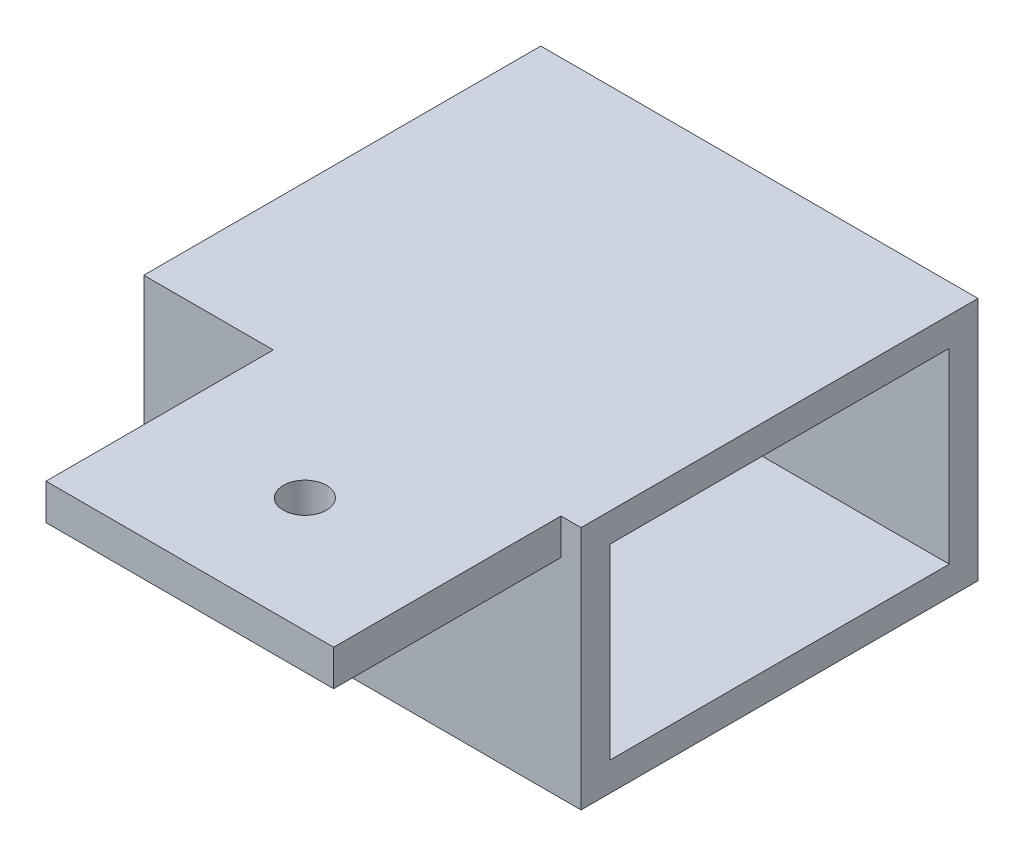
ISO-10303-21;
HEADER;
FILE_DESCRIPTION(('STEP AP214'),'2;1');
FILE_NAME('part.step','',(''),(''),'','','');
FILE_SCHEMA(('AUTOMOTIVE_DESIGN { 1 0 10303 214 1 1 1 1 }'));
ENDSEC;
DATA;
#1=APPLICATION_CONTEXT('core data for automotive mechanical design processes');
#2=APPLICATION_PROTOCOL_DEFINITION('international standard','automotive_design',2000,#1);
#3=PRODUCT_CONTEXT('',#1,'mechanical');
#4=PRODUCT('Part','Part','',(#3));
#5=PRODUCT_RELATED_PRODUCT_CATEGORY('part','',(#4));
#6=PRODUCT_DEFINITION_FORMATION('','',#4);
#7=PRODUCT_DEFINITION_CONTEXT('part definition',#1,'design');
#8=PRODUCT_DEFINITION('design','',#6,#7);
#9=PRODUCT_DEFINITION_SHAPE('','',#8);
#10=(LENGTH_UNIT() NAMED_UNIT(*) SI_UNIT(.MILLI.,.METRE.));
#11=(NAMED_UNIT(*) PLANE_ANGLE_UNIT() SI_UNIT($,.RADIAN.));
#12=(NAMED_UNIT(*) SI_UNIT($,.STERADIAN.) SOLID_ANGLE_UNIT());
#13=UNCERTAINTY_MEASURE_WITH_UNIT(LENGTH_MEASURE(1.E-05),#10,'distance_accuracy_value','');
#14=(GEOMETRIC_REPRESENTATION_CONTEXT(3) GLOBAL_UNCERTAINTY_ASSIGNED_CONTEXT((#13)) GLOBAL_UNIT_ASSIGNED_CONTEXT((#10,
#11,#12)) REPRESENTATION_CONTEXT('',''));
#15=CARTESIAN_POINT('',(0.,0.,0.));
#16=DIRECTION('',(0.,0.,1.));
#17=DIRECTION('',(1.,0.,0.));
#18=AXIS2_PLACEMENT_3D('',#15,#16,#17);
#19=CARTESIAN_POINT('',(-10.,-1.5,8.));
#20=DIRECTION('',(1.,0.,0.));
#21=DIRECTION('',(0.,0.,-1.));
#22=AXIS2_PLACEMENT_3D('',#19,#20,#21);
#23=PLANE('',#22);
#24=DIRECTION('',(0.,0.,-1.));
#25=VECTOR('',#24,1.);
#26=CARTESIAN_POINT('',(-10.,-1.5,8.));
#27=LINE('',#26,#25);
#28=CARTESIAN_POINT('',(-10.,-1.5,8.));
#29=VERTEX_POINT('',#28);
#30=CARTESIAN_POINT('',(-9.99999999999999,-1.5,-7.8));
#31=VERTEX_POINT('',#30);
#32=EDGE_CURVE('E158',#29,#31,#27,.T.);
#33=ORIENTED_EDGE('',*,*,#32,.T.);
#34=DIRECTION('',(0.,-1.,0.));
#35=VECTOR('',#34,1.);
#36=CARTESIAN_POINT('',(-10.,-1.5,-7.8));
#37=LINE('',#36,#35);
#38=CARTESIAN_POINT('',(-10.,-4.,-7.8));
#39=VERTEX_POINT('',#38);
#40=EDGE_CURVE('E168',#31,#39,#37,.T.);
#41=ORIENTED_EDGE('',*,*,#40,.T.);
#42=DIRECTION('',(0.,0.,-1.));
#43=VECTOR('',#42,1.);
#44=CARTESIAN_POINT('',(-10.,-4.,8.));
#45=LINE('',#44,#43);
#46=CARTESIAN_POINT('',(-10.,-4.,8.));
#47=VERTEX_POINT('',#46);
#48=EDGE_CURVE('E149',#47,#39,#45,.T.);
#49=ORIENTED_EDGE('',*,*,#48,.F.);
#50=DIRECTION('',(0.,-1.,0.));
#51=VECTOR('',#50,1.);
#52=CARTESIAN_POINT('',(-10.,-1.5,8.));
#53=LINE('',#52,#51);
#54=EDGE_CURVE('E170',#29,#47,#53,.T.);
#55=ORIENTED_EDGE('',*,*,#54,.F.);
#56=EDGE_LOOP('',(#33,#41,#49,#55));
#57=FACE_BOUND('',#56,.T.);
#58=ADVANCED_FACE('F39',(#57),#23,.F.);
#59=CARTESIAN_POINT('',(-10.,-4.,8.));
#60=DIRECTION('',(0.,1.,0.));
#61=DIRECTION('',(0.,0.,1.));
#62=AXIS2_PLACEMENT_3D('',#59,#60,#61);
#63=PLANE('',#62);
#64=CARTESIAN_POINT('',(0.,-4.,0.));
#65=DIRECTION('',(0.,1.,0.));
#66=DIRECTION('',(0.,0.,1.));
#67=AXIS2_PLACEMENT_3D('',#64,#65,#66);
#68=CIRCLE('',#67,1.5);
#69=CARTESIAN_POINT('',(0.,-4.,-1.5));
#70=VERTEX_POINT('',#69);
#71=EDGE_CURVE('E220',#70,#70,#68,.F.);
#72=ORIENTED_EDGE('',*,*,#71,.F.);
#73=EDGE_LOOP('',(#72));
#74=FACE_BOUND('',#73,.T.);
#75=ORIENTED_EDGE('',*,*,#48,.T.);
#76=DIRECTION('',(1.,0.,0.));
#77=VECTOR('',#76,1.);
#78=CARTESIAN_POINT('',(-10.,-4.,-7.8));
#79=LINE('',#78,#77);
#80=CARTESIAN_POINT('',(10.,-4.,-7.8));
#81=VERTEX_POINT('',#80);
#82=EDGE_CURVE('E172',#39,#81,#79,.T.);
#83=ORIENTED_EDGE('',*,*,#82,.T.);
#84=DIRECTION('',(0.,0.,-1.));
#85=VECTOR('',#84,1.);
#86=CARTESIAN_POINT('',(10.,-4.,8.));
#87=LINE('',#86,#85);
#88=CARTESIAN_POINT('',(10.,-4.,8.));
#89=VERTEX_POINT('',#88);
#90=EDGE_CURVE('E155',#89,#81,#87,.T.);
#91=ORIENTED_EDGE('',*,*,#90,.F.);
#92=DIRECTION('',(1.,0.,0.));
#93=VECTOR('',#92,1.);
#94=CARTESIAN_POINT('',(-10.,-4.,8.));
#95=LINE('',#94,#93);
#96=EDGE_CURVE('E164',#47,#89,#95,.T.);
#97=ORIENTED_EDGE('',*,*,#96,.F.);
#98=EDGE_LOOP('',(#75,#83,#91,#97));
#99=FACE_BOUND('',#98,.T.);
#100=ADVANCED_FACE('F244',(#74,#99),#63,.F.);
#101=CARTESIAN_POINT('',(10.,-4.,8.));
#102=DIRECTION('',(-1.,0.,0.));
#103=DIRECTION('',(0.,0.,1.));
#104=AXIS2_PLACEMENT_3D('',#101,#102,#103);
#105=PLANE('',#104);
#106=ORIENTED_EDGE('',*,*,#90,.T.);
#107=DIRECTION('',(0.,1.,0.));
#108=VECTOR('',#107,1.);
#109=CARTESIAN_POINT('',(10.,-4.,-7.8));
#110=LINE('',#109,#108);
#111=CARTESIAN_POINT('',(10.,-1.5,-7.8));
#112=VERTEX_POINT('',#111);
#113=EDGE_CURVE('E131',#81,#112,#110,.T.);
#114=ORIENTED_EDGE('',*,*,#113,.T.);
#115=DIRECTION('',(0.,0.,-1.));
#116=VECTOR('',#115,1.);
#117=CARTESIAN_POINT('',(10.,-1.5,8.));
#118=LINE('',#117,#116);
#119=CARTESIAN_POINT('',(10.,-1.5,8.));
#120=VERTEX_POINT('',#119);
#121=EDGE_CURVE('E154',#120,#112,#118,.T.);
#122=ORIENTED_EDGE('',*,*,#121,.F.);
#123=DIRECTION('',(0.,1.,0.));
#124=VECTOR('',#123,1.);
#125=CARTESIAN_POINT('',(10.,-4.,8.));
#126=LINE('',#125,#124);
#127=EDGE_CURVE('E162',#89,#120,#126,.T.);
#128=ORIENTED_EDGE('',*,*,#127,.F.);
#129=EDGE_LOOP('',(#106,#114,#122,#128));
#130=FACE_BOUND('',#129,.T.);
#131=ADVANCED_FACE('F231',(#130),#105,.F.);
#132=CARTESIAN_POINT('',(10.,-1.5,8.));
#133=DIRECTION('',(0.,-1.,0.));
#134=DIRECTION('',(0.,0.,-1.));
#135=AXIS2_PLACEMENT_3D('',#132,#133,#134);
#136=PLANE('',#135);
#137=CARTESIAN_POINT('',(0.,-1.5,0.));
#138=DIRECTION('',(0.,-1.,0.));
#139=DIRECTION('',(0.,0.,-1.));
#140=AXIS2_PLACEMENT_3D('',#137,#138,#139);
#141=CIRCLE('',#140,1.5);
#142=CARTESIAN_POINT('',(0.,-1.5,-1.5));
#143=VERTEX_POINT('',#142);
#144=EDGE_CURVE('E45',#143,#143,#141,.F.);
#145=ORIENTED_EDGE('',*,*,#144,.F.);
#146=EDGE_LOOP('',(#145));
#147=FACE_BOUND('',#146,.T.);
#148=ORIENTED_EDGE('',*,*,#121,.T.);
#149=DIRECTION('',(-1.,0.,0.));
#150=VECTOR('',#149,1.);
#151=CARTESIAN_POINT('',(11.4,-1.5,-7.8));
#152=LINE('',#151,#150);
#153=CARTESIAN_POINT('',(11.4,-1.5,-7.8));
#154=VERTEX_POINT('',#153);
#155=EDGE_CURVE('E187',#154,#112,#152,.T.);
#156=ORIENTED_EDGE('',*,*,#155,.F.);
#157=DIRECTION('',(0.,0.,-1.));
#158=VECTOR('',#157,1.);
#159=CARTESIAN_POINT('',(11.4,-1.5,-7.8));
#160=LINE('',#159,#158);
#161=CARTESIAN_POINT('',(11.4,-1.5,-35.4));
#162=VERTEX_POINT('',#161);
#163=EDGE_CURVE('E185',#154,#162,#160,.T.);
#164=ORIENTED_EDGE('',*,*,#163,.T.);
#165=DIRECTION('',(-1.,0.,0.));
#166=VECTOR('',#165,1.);
#167=CARTESIAN_POINT('',(11.4,-1.5,-35.4));
#168=LINE('',#167,#166);
#169=CARTESIAN_POINT('',(-19.,-1.5,-35.4));
#170=VERTEX_POINT('',#169);
#171=EDGE_CURVE('E188',#162,#170,#168,.T.);
#172=ORIENTED_EDGE('',*,*,#171,.T.);
#173=DIRECTION('',(0.,0.,-1.));
#174=VECTOR('',#173,1.);
#175=CARTESIAN_POINT('',(-19.,-1.5,-7.8));
#176=LINE('',#175,#174);
#177=CARTESIAN_POINT('',(-19.,-1.5,-7.8));
#178=VERTEX_POINT('',#177);
#179=EDGE_CURVE('E183',#178,#170,#176,.T.);
#180=ORIENTED_EDGE('',*,*,#179,.F.);
#181=EDGE_CURVE('E203',#31,#178,#152,.T.);
#182=ORIENTED_EDGE('',*,*,#181,.F.);
#183=ORIENTED_EDGE('',*,*,#32,.F.);
#184=DIRECTION('',(-1.,0.,0.));
#185=VECTOR('',#184,1.);
#186=CARTESIAN_POINT('',(10.,-1.5,8.));
#187=LINE('',#186,#185);
#188=EDGE_CURVE('E161',#120,#29,#187,.T.);
#189=ORIENTED_EDGE('',*,*,#188,.F.);
#190=EDGE_LOOP('',(#148,#156,#164,#172,#180,#182,#183,#189));
#191=FACE_BOUND('',#190,.T.);
#192=ADVANCED_FACE('F228',(#147,#191),#136,.F.);
#193=CARTESIAN_POINT('',(0.,0.,8.));
#194=DIRECTION('',(0.,0.,1.));
#195=DIRECTION('',(1.,0.,0.));
#196=AXIS2_PLACEMENT_3D('',#193,#194,#195);
#197=PLANE('',#196);
#198=ORIENTED_EDGE('',*,*,#54,.T.);
#199=ORIENTED_EDGE('',*,*,#96,.T.);
#200=ORIENTED_EDGE('',*,*,#127,.T.);
#201=ORIENTED_EDGE('',*,*,#188,.T.);
#202=EDGE_LOOP('',(#198,#199,#200,#201));
#203=FACE_BOUND('',#202,.T.);
#204=ADVANCED_FACE('F235',(#203),#197,.T.);
#205=CARTESIAN_POINT('',(0.,0.,-7.8));
#206=DIRECTION('',(0.,0.,1.));
#207=DIRECTION('',(1.,0.,0.));
#208=AXIS2_PLACEMENT_3D('',#205,#206,#207);
#209=PLANE('',#208);
#210=ORIENTED_EDGE('',*,*,#40,.F.);
#211=ORIENTED_EDGE('',*,*,#181,.T.);
#212=DIRECTION('',(0.,-1.,0.));
#213=VECTOR('',#212,1.);
#214=CARTESIAN_POINT('',(-19.,-1.5,-7.8));
#215=LINE('',#214,#213);
#216=CARTESIAN_POINT('',(-19.,-18.5,-7.8));
#217=VERTEX_POINT('',#216);
#218=EDGE_CURVE('E193',#178,#217,#215,.T.);
#219=ORIENTED_EDGE('',*,*,#218,.T.);
#220=DIRECTION('',(1.,0.,0.));
#221=VECTOR('',#220,1.);
#222=CARTESIAN_POINT('',(-19.,-18.5,-7.8));
#223=LINE('',#222,#221);
#224=CARTESIAN_POINT('',(11.4,-18.5,-7.8));
#225=VERTEX_POINT('',#224);
#226=EDGE_CURVE('E204',#217,#225,#223,.T.);
#227=ORIENTED_EDGE('',*,*,#226,.T.);
#228=DIRECTION('',(0.,1.,0.));
#229=VECTOR('',#228,1.);
#230=CARTESIAN_POINT('',(11.4,-18.5,-7.8));
#231=LINE('',#230,#229);
#232=EDGE_CURVE('E205',#225,#154,#231,.T.);
#233=ORIENTED_EDGE('',*,*,#232,.T.);
#234=ORIENTED_EDGE('',*,*,#155,.T.);
#235=ORIENTED_EDGE('',*,*,#113,.F.);
#236=ORIENTED_EDGE('',*,*,#82,.F.);
#237=EDGE_LOOP('',(#210,#211,#219,#227,#233,#234,#235,#236));
#238=FACE_BOUND('',#237,.T.);
#239=ADVANCED_FACE('F242',(#238),#209,.T.);
#240=CARTESIAN_POINT('',(-19.,-1.5,-7.8));
#241=DIRECTION('',(1.,0.,0.));
#242=DIRECTION('',(0.,0.,-1.));
#243=AXIS2_PLACEMENT_3D('',#240,#241,#242);
#244=PLANE('',#243);
#245=DIRECTION('',(0.,0.,-1.));
#246=VECTOR('',#245,1.);
#247=CARTESIAN_POINT('',(-19.,-3.5,-7.8));
#248=LINE('',#247,#246);
#249=CARTESIAN_POINT('',(-19.,-3.5,-9.8));
#250=VERTEX_POINT('',#249);
#251=CARTESIAN_POINT('',(-19.,-3.5,-33.4));
#252=VERTEX_POINT('',#251);
#253=EDGE_CURVE('E136',#250,#252,#248,.T.);
#254=ORIENTED_EDGE('',*,*,#253,.F.);
#255=DIRECTION('',(0.,-1.,0.));
#256=VECTOR('',#255,1.);
#257=CARTESIAN_POINT('',(-19.,-1.5,-9.8));
#258=LINE('',#257,#256);
#259=CARTESIAN_POINT('',(-19.,-16.5,-9.8));
#260=VERTEX_POINT('',#259);
#261=EDGE_CURVE('E209',#250,#260,#258,.T.);
#262=ORIENTED_EDGE('',*,*,#261,.T.);
#263=DIRECTION('',(0.,0.,1.));
#264=VECTOR('',#263,1.);
#265=CARTESIAN_POINT('',(-19.,-16.5,-7.8));
#266=LINE('',#265,#264);
#267=CARTESIAN_POINT('',(-19.,-16.5,-33.4));
#268=VERTEX_POINT('',#267);
#269=EDGE_CURVE('E200',#268,#260,#266,.T.);
#270=ORIENTED_EDGE('',*,*,#269,.F.);
#271=DIRECTION('',(0.,-1.,0.));
#272=VECTOR('',#271,1.);
#273=CARTESIAN_POINT('',(-19.,-1.5,-33.4));
#274=LINE('',#273,#272);
#275=EDGE_CURVE('E213',#252,#268,#274,.T.);
#276=ORIENTED_EDGE('',*,*,#275,.F.);
#277=EDGE_LOOP('',(#254,#262,#270,#276));
#278=FACE_BOUND('',#277,.T.);
#279=DIRECTION('',(0.,-1.,0.));
#280=VECTOR('',#279,1.);
#281=CARTESIAN_POINT('',(-19.,-1.5,-35.4));
#282=LINE('',#281,#280);
#283=CARTESIAN_POINT('',(-19.,-18.5,-35.4));
#284=VERTEX_POINT('',#283);
#285=EDGE_CURVE('E198',#170,#284,#282,.T.);
#286=ORIENTED_EDGE('',*,*,#285,.T.);
#287=DIRECTION('',(0.,0.,-1.));
#288=VECTOR('',#287,1.);
#289=CARTESIAN_POINT('',(-19.,-18.5,-7.8));
#290=LINE('',#289,#288);
#291=EDGE_CURVE('E178',#217,#284,#290,.T.);
#292=ORIENTED_EDGE('',*,*,#291,.F.);
#293=ORIENTED_EDGE('',*,*,#218,.F.);
#294=ORIENTED_EDGE('',*,*,#179,.T.);
#295=EDGE_LOOP('',(#286,#292,#293,#294));
#296=FACE_BOUND('',#295,.T.);
#297=ADVANCED_FACE('F258',(#278,#296),#244,.F.);
#298=CARTESIAN_POINT('',(-19.,-18.5,-7.8));
#299=DIRECTION('',(0.,1.,0.));
#300=DIRECTION('',(0.,0.,1.));
#301=AXIS2_PLACEMENT_3D('',#298,#299,#300);
#302=PLANE('',#301);
#303=DIRECTION('',(1.,0.,0.));
#304=VECTOR('',#303,1.);
#305=CARTESIAN_POINT('',(-19.,-18.5,-35.4));
#306=LINE('',#305,#304);
#307=CARTESIAN_POINT('',(11.4,-18.5,-35.4));
#308=VERTEX_POINT('',#307);
#309=EDGE_CURVE('E194',#284,#308,#306,.T.);
#310=ORIENTED_EDGE('',*,*,#309,.T.);
#311=DIRECTION('',(0.,0.,-1.));
#312=VECTOR('',#311,1.);
#313=CARTESIAN_POINT('',(11.4,-18.5,-7.8));
#314=LINE('',#313,#312);
#315=EDGE_CURVE('E179',#225,#308,#314,.T.);
#316=ORIENTED_EDGE('',*,*,#315,.F.);
#317=ORIENTED_EDGE('',*,*,#226,.F.);
#318=ORIENTED_EDGE('',*,*,#291,.T.);
#319=EDGE_LOOP('',(#310,#316,#317,#318));
#320=FACE_BOUND('',#319,.T.);
#321=ADVANCED_FACE('F261',(#320),#302,.F.);
#322=CARTESIAN_POINT('',(11.4,-18.5,-7.8));
#323=DIRECTION('',(-1.,0.,0.));
#324=DIRECTION('',(0.,0.,1.));
#325=AXIS2_PLACEMENT_3D('',#322,#323,#324);
#326=PLANE('',#325);
#327=DIRECTION('',(0.,0.,-1.));
#328=VECTOR('',#327,1.);
#329=CARTESIAN_POINT('',(11.4,-16.5,-7.8));
#330=LINE('',#329,#328);
#331=CARTESIAN_POINT('',(11.4,-16.5,-9.8));
#332=VERTEX_POINT('',#331);
#333=CARTESIAN_POINT('',(11.4,-16.5,-33.4));
#334=VERTEX_POINT('',#333);
#335=EDGE_CURVE('E50',#332,#334,#330,.T.);
#336=ORIENTED_EDGE('',*,*,#335,.F.);
#337=DIRECTION('',(0.,1.,0.));
#338=VECTOR('',#337,1.);
#339=CARTESIAN_POINT('',(11.4,-18.5,-9.8));
#340=LINE('',#339,#338);
#341=CARTESIAN_POINT('',(11.4,-3.5,-9.8));
#342=VERTEX_POINT('',#341);
#343=EDGE_CURVE('E11',#332,#342,#340,.T.);
#344=ORIENTED_EDGE('',*,*,#343,.T.);
#345=DIRECTION('',(0.,0.,1.));
#346=VECTOR('',#345,1.);
#347=CARTESIAN_POINT('',(11.4,-3.5,-7.8));
#348=LINE('',#347,#346);
#349=CARTESIAN_POINT('',(11.4,-3.5,-33.4));
#350=VERTEX_POINT('',#349);
#351=EDGE_CURVE('E128',#350,#342,#348,.T.);
#352=ORIENTED_EDGE('',*,*,#351,.F.);
#353=DIRECTION('',(0.,1.,0.));
#354=VECTOR('',#353,1.);
#355=CARTESIAN_POINT('',(11.4,-18.5,-33.4));
#356=LINE('',#355,#354);
#357=EDGE_CURVE('E122',#334,#350,#356,.T.);
#358=ORIENTED_EDGE('',*,*,#357,.F.);
#359=EDGE_LOOP('',(#336,#344,#352,#358));
#360=FACE_BOUND('',#359,.T.);
#361=DIRECTION('',(0.,1.,0.));
#362=VECTOR('',#361,1.);
#363=CARTESIAN_POINT('',(11.4,-18.5,-35.4));
#364=LINE('',#363,#362);
#365=EDGE_CURVE('E195',#308,#162,#364,.T.);
#366=ORIENTED_EDGE('',*,*,#365,.T.);
#367=ORIENTED_EDGE('',*,*,#163,.F.);
#368=ORIENTED_EDGE('',*,*,#232,.F.);
#369=ORIENTED_EDGE('',*,*,#315,.T.);
#370=EDGE_LOOP('',(#366,#367,#368,#369));
#371=FACE_BOUND('',#370,.T.);
#372=ADVANCED_FACE('F142',(#360,#371),#326,.F.);
#373=CARTESIAN_POINT('',(0.,0.,-35.4));
#374=DIRECTION('',(0.,0.,1.));
#375=DIRECTION('',(1.,0.,0.));
#376=AXIS2_PLACEMENT_3D('',#373,#374,#375);
#377=PLANE('',#376);
#378=ORIENTED_EDGE('',*,*,#285,.F.);
#379=ORIENTED_EDGE('',*,*,#171,.F.);
#380=ORIENTED_EDGE('',*,*,#365,.F.);
#381=ORIENTED_EDGE('',*,*,#309,.F.);
#382=EDGE_LOOP('',(#378,#379,#380,#381));
#383=FACE_BOUND('',#382,.T.);
#384=ADVANCED_FACE('F262',(#383),#377,.F.);
#385=CARTESIAN_POINT('',(-19.1,-16.5,-9.8));
#386=DIRECTION('',(0.,1.,0.));
#387=DIRECTION('',(0.,0.,1.));
#388=AXIS2_PLACEMENT_3D('',#385,#386,#387);
#389=PLANE('',#388);
#390=ORIENTED_EDGE('',*,*,#269,.T.);
#391=DIRECTION('',(1.,0.,0.));
#392=VECTOR('',#391,1.);
#393=CARTESIAN_POINT('',(-19.1,-16.5,-9.8));
#394=LINE('',#393,#392);
#395=EDGE_CURVE('E137',#260,#332,#394,.T.);
#396=ORIENTED_EDGE('',*,*,#395,.T.);
#397=ORIENTED_EDGE('',*,*,#335,.T.);
#398=DIRECTION('',(1.,0.,0.));
#399=VECTOR('',#398,1.);
#400=CARTESIAN_POINT('',(-19.1,-16.5,-33.4));
#401=LINE('',#400,#399);
#402=EDGE_CURVE('E56',#268,#334,#401,.T.);
#403=ORIENTED_EDGE('',*,*,#402,.F.);
#404=EDGE_LOOP('',(#390,#396,#397,#403));
#405=FACE_BOUND('',#404,.T.);
#406=ADVANCED_FACE('F266',(#405),#389,.T.);
#407=CARTESIAN_POINT('',(11.5,-3.5,-9.8));
#408=DIRECTION('',(0.,-1.,0.));
#409=DIRECTION('',(0.,0.,-1.));
#410=AXIS2_PLACEMENT_3D('',#407,#408,#409);
#411=PLANE('',#410);
#412=ORIENTED_EDGE('',*,*,#253,.T.);
#413=DIRECTION('',(-1.,0.,0.));
#414=VECTOR('',#413,1.);
#415=CARTESIAN_POINT('',(11.5,-3.5,-33.4));
#416=LINE('',#415,#414);
#417=EDGE_CURVE('E53',#350,#252,#416,.T.);
#418=ORIENTED_EDGE('',*,*,#417,.F.);
#419=ORIENTED_EDGE('',*,*,#351,.T.);
#420=DIRECTION('',(-1.,0.,0.));
#421=VECTOR('',#420,1.);
#422=CARTESIAN_POINT('',(11.5,-3.5,-9.8));
#423=LINE('',#422,#421);
#424=EDGE_CURVE('E212',#342,#250,#423,.T.);
#425=ORIENTED_EDGE('',*,*,#424,.T.);
#426=EDGE_LOOP('',(#412,#418,#419,#425));
#427=FACE_BOUND('',#426,.T.);
#428=ADVANCED_FACE('F133',(#427),#411,.T.);
#429=CARTESIAN_POINT('',(0.,0.,-9.8));
#430=DIRECTION('',(0.,0.,1.));
#431=DIRECTION('',(1.,0.,0.));
#432=AXIS2_PLACEMENT_3D('',#429,#430,#431);
#433=PLANE('',#432);
#434=ORIENTED_EDGE('',*,*,#424,.F.);
#435=ORIENTED_EDGE('',*,*,#343,.F.);
#436=ORIENTED_EDGE('',*,*,#395,.F.);
#437=ORIENTED_EDGE('',*,*,#261,.F.);
#438=EDGE_LOOP('',(#434,#435,#436,#437));
#439=FACE_BOUND('',#438,.T.);
#440=ADVANCED_FACE('F353',(#439),#433,.F.);
#441=CARTESIAN_POINT('',(0.,0.,-33.4));
#442=DIRECTION('',(0.,0.,1.));
#443=DIRECTION('',(1.,0.,0.));
#444=AXIS2_PLACEMENT_3D('',#441,#442,#443);
#445=PLANE('',#444);
#446=ORIENTED_EDGE('',*,*,#275,.T.);
#447=ORIENTED_EDGE('',*,*,#402,.T.);
#448=ORIENTED_EDGE('',*,*,#357,.T.);
#449=ORIENTED_EDGE('',*,*,#417,.T.);
#450=EDGE_LOOP('',(#446,#447,#448,#449));
#451=FACE_BOUND('',#450,.T.);
#452=ADVANCED_FACE('F127',(#451),#445,.T.);
#453=CARTESIAN_POINT('',(0.,-1.4,0.));
#454=DIRECTION('',(0.,-1.,0.));
#455=DIRECTION('',(0.,0.,-1.));
#456=AXIS2_PLACEMENT_3D('',#453,#454,#455);
#457=CYLINDRICAL_SURFACE('',#456,1.5);
#458=CARTESIAN_POINT('',(0.,-1.5,-1.5));
#459=CARTESIAN_POINT('',(0.,-1.52604166666667,-1.5));
#460=CARTESIAN_POINT('',(0.,-1.55208333333333,-1.5));
#461=CARTESIAN_POINT('',(0.,-1.60416666666667,-1.5));
#462=CARTESIAN_POINT('',(0.,-1.63020833333333,-1.5));
#463=CARTESIAN_POINT('',(0.,-1.68229166666667,-1.5));
#464=CARTESIAN_POINT('',(0.,-1.70833333333333,-1.5));
#465=CARTESIAN_POINT('',(0.,-1.76041666666667,-1.5));
#466=CARTESIAN_POINT('',(0.,-1.78645833333333,-1.5));
#467=CARTESIAN_POINT('',(0.,-1.83854166666667,-1.5));
#468=CARTESIAN_POINT('',(0.,-1.86458333333333,-1.5));
#469=CARTESIAN_POINT('',(0.,-1.91666666666667,-1.5));
#470=CARTESIAN_POINT('',(0.,-1.94270833333333,-1.5));
#471=CARTESIAN_POINT('',(0.,-1.99479166666667,-1.5));
#472=CARTESIAN_POINT('',(0.,-2.02083333333333,-1.5));
#473=CARTESIAN_POINT('',(0.,-2.07291666666667,-1.5));
#474=CARTESIAN_POINT('',(0.,-2.09895833333333,-1.5));
#475=CARTESIAN_POINT('',(0.,-2.15104166666667,-1.5));
#476=CARTESIAN_POINT('',(0.,-2.17708333333333,-1.5));
#477=CARTESIAN_POINT('',(0.,-2.22916666666667,-1.5));
#478=CARTESIAN_POINT('',(0.,-2.25520833333333,-1.5));
#479=CARTESIAN_POINT('',(0.,-2.30729166666667,-1.5));
#480=CARTESIAN_POINT('',(0.,-2.33333333333333,-1.5));
#481=CARTESIAN_POINT('',(0.,-2.38541666666667,-1.5));
#482=CARTESIAN_POINT('',(0.,-2.41145833333333,-1.5));
#483=CARTESIAN_POINT('',(0.,-2.46354166666667,-1.5));
#484=CARTESIAN_POINT('',(0.,-2.48958333333333,-1.5));
#485=CARTESIAN_POINT('',(0.,-2.54166666666667,-1.5));
#486=CARTESIAN_POINT('',(0.,-2.56770833333333,-1.5));
#487=CARTESIAN_POINT('',(0.,-2.61979166666667,-1.5));
#488=CARTESIAN_POINT('',(0.,-2.64583333333333,-1.5));
#489=CARTESIAN_POINT('',(0.,-2.69791666666667,-1.5));
#490=CARTESIAN_POINT('',(0.,-2.72395833333333,-1.5));
#491=CARTESIAN_POINT('',(0.,-2.77604166666667,-1.5));
#492=CARTESIAN_POINT('',(0.,-2.80208333333333,-1.5));
#493=CARTESIAN_POINT('',(0.,-2.85416666666667,-1.5));
#494=CARTESIAN_POINT('',(0.,-2.88020833333333,-1.5));
#495=CARTESIAN_POINT('',(0.,-2.93229166666667,-1.5));
#496=CARTESIAN_POINT('',(0.,-2.95833333333333,-1.5));
#497=CARTESIAN_POINT('',(0.,-3.01041666666667,-1.5));
#498=CARTESIAN_POINT('',(0.,-3.03645833333333,-1.5));
#499=CARTESIAN_POINT('',(0.,-3.08854166666667,-1.5));
#500=CARTESIAN_POINT('',(0.,-3.11458333333333,-1.5));
#501=CARTESIAN_POINT('',(0.,-3.16666666666667,-1.5));
#502=CARTESIAN_POINT('',(0.,-3.19270833333333,-1.5));
#503=CARTESIAN_POINT('',(0.,-3.24479166666667,-1.5));
#504=CARTESIAN_POINT('',(0.,-3.27083333333333,-1.5));
#505=CARTESIAN_POINT('',(0.,-3.32291666666667,-1.5));
#506=CARTESIAN_POINT('',(0.,-3.34895833333333,-1.5));
#507=CARTESIAN_POINT('',(0.,-3.40104166666667,-1.5));
#508=CARTESIAN_POINT('',(0.,-3.42708333333333,-1.5));
#509=CARTESIAN_POINT('',(0.,-3.47916666666667,-1.5));
#510=CARTESIAN_POINT('',(0.,-3.50520833333333,-1.5));
#511=CARTESIAN_POINT('',(0.,-3.55729166666667,-1.5));
#512=CARTESIAN_POINT('',(0.,-3.58333333333333,-1.5));
#513=CARTESIAN_POINT('',(0.,-3.63541666666667,-1.5));
#514=CARTESIAN_POINT('',(0.,-3.66145833333333,-1.5));
#515=CARTESIAN_POINT('',(0.,-3.71354166666667,-1.5));
#516=CARTESIAN_POINT('',(0.,-3.73958333333333,-1.5));
#517=CARTESIAN_POINT('',(0.,-3.79166666666667,-1.5));
#518=CARTESIAN_POINT('',(0.,-3.81770833333333,-1.5));
#519=CARTESIAN_POINT('',(0.,-3.86979166666667,-1.5));
#520=CARTESIAN_POINT('',(0.,-3.89583333333333,-1.5));
#521=CARTESIAN_POINT('',(0.,-3.94791666666667,-1.5));
#522=CARTESIAN_POINT('',(0.,-3.97395833333333,-1.5));
#523=CARTESIAN_POINT('',(0.,-4.,-1.5));
#524=B_SPLINE_CURVE_WITH_KNOTS('',3,(#458,#459,#460,#461,#462,#463,#464,#465,#466,#467,#468,
#469,#470,#471,#472,#473,#474,#475,#476,#477,#478,#479,#480,#481,#482,#483,#484,#485,#486,#487,
#488,#489,#490,#491,#492,#493,#494,#495,#496,#497,#498,#499,#500,#501,#502,#503,#504,#505,#506,
#507,#508,#509,#510,#511,#512,#513,#514,#515,#516,#517,#518,#519,#520,#521,#522,#523),
.UNSPECIFIED.,.F.,.F.,(4,2,2,2,2,2,2,2,2,2,2,2,2,2,2,2,2,2,2,2,2,2,2,2,2,2,2,2,2,2,2,2,4),(0.,
0.0781249999999998,0.15625,0.234375,0.3125,0.390625,0.46875,0.546875,0.625,0.703125,0.78125,
0.859375,0.9375,1.015625,1.09375,1.171875,1.25,1.328125,1.40625,1.484375,1.5625,1.640625,
1.71875,1.796875,1.875,1.953125,2.03125,2.109375,2.1875,2.265625,2.34375,2.421875,2.5),.UNSPECIFIED.);
#525=EDGE_CURVE('BSEAM230',#143,#70,#524,.T.);
#526=ORIENTED_EDGE('',*,*,#144,.T.);
#527=ORIENTED_EDGE('',*,*,#71,.T.);
#528=ORIENTED_EDGE('',*,*,#525,.T.);
#529=ORIENTED_EDGE('',*,*,#525,.F.);
#530=EDGE_LOOP('',(#526,#528,#527,#529));
#531=FACE_BOUND('',#530,.T.);
#532=ADVANCED_FACE('F230',(#531),#457,.F.);
#533=CLOSED_SHELL('',(#58,#100,#131,#192,#204,#239,#297,#321,#372,#384,#406,#428,#440,#452,#532));
#534=MANIFOLD_SOLID_BREP('B2',#533);
#535=ADVANCED_BREP_SHAPE_REPRESENTATION('',(#18,#534),#14);
#536=SHAPE_DEFINITION_REPRESENTATION(#9,#535);
ENDSEC;
END-ISO-10303-21;
